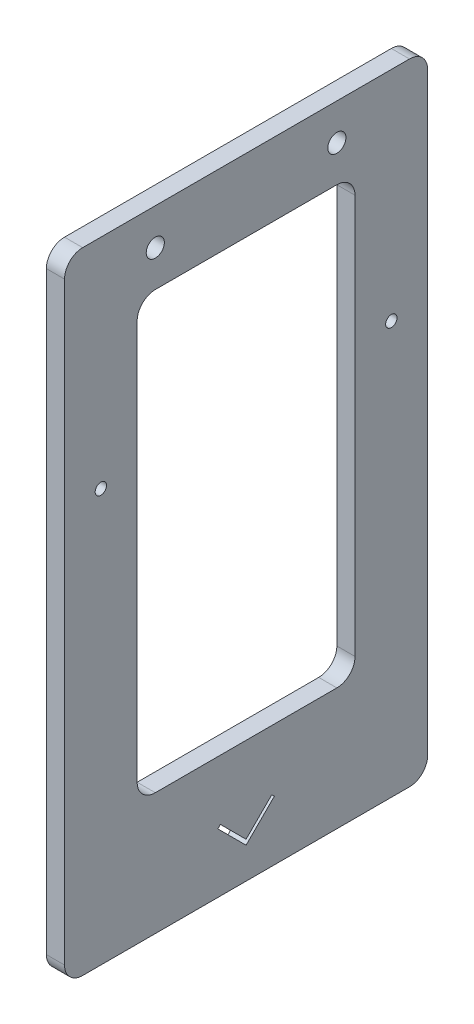
ISO-10303-21;
HEADER;
FILE_DESCRIPTION(('STEP AP214'),'2;1');
FILE_NAME('part.step','',(''),(''),'','','');
FILE_SCHEMA(('AUTOMOTIVE_DESIGN { 1 0 10303 214 1 1 1 1 }'));
ENDSEC;
DATA;
#1=APPLICATION_CONTEXT('core data for automotive mechanical design processes');
#2=APPLICATION_PROTOCOL_DEFINITION('international standard','automotive_design',2000,#1);
#3=PRODUCT_CONTEXT('',#1,'mechanical');
#4=PRODUCT('Part','Part','',(#3));
#5=PRODUCT_RELATED_PRODUCT_CATEGORY('part','',(#4));
#6=PRODUCT_DEFINITION_FORMATION('','',#4);
#7=PRODUCT_DEFINITION_CONTEXT('part definition',#1,'design');
#8=PRODUCT_DEFINITION('design','',#6,#7);
#9=PRODUCT_DEFINITION_SHAPE('','',#8);
#10=(LENGTH_UNIT() NAMED_UNIT(*) SI_UNIT(.MILLI.,.METRE.));
#11=(NAMED_UNIT(*) PLANE_ANGLE_UNIT() SI_UNIT($,.RADIAN.));
#12=(NAMED_UNIT(*) SI_UNIT($,.STERADIAN.) SOLID_ANGLE_UNIT());
#13=UNCERTAINTY_MEASURE_WITH_UNIT(LENGTH_MEASURE(1.E-05),#10,'distance_accuracy_value','');
#14=(GEOMETRIC_REPRESENTATION_CONTEXT(3) GLOBAL_UNCERTAINTY_ASSIGNED_CONTEXT((#13)) GLOBAL_UNIT_ASSIGNED_CONTEXT((#10,
#11,#12)) REPRESENTATION_CONTEXT('',''));
#15=CARTESIAN_POINT('',(0.,0.,0.));
#16=DIRECTION('',(0.,0.,1.));
#17=DIRECTION('',(1.,0.,0.));
#18=AXIS2_PLACEMENT_3D('',#15,#16,#17);
#19=CARTESIAN_POINT('',(6.35,-103.886,57.15));
#20=DIRECTION('',(-1.,0.,0.));
#21=DIRECTION('',(0.,0.,1.));
#22=AXIS2_PLACEMENT_3D('',#19,#20,#21);
#23=PLANE('',#22);
#24=CARTESIAN_POINT('',(6.35,34.036,50.8));
#25=DIRECTION('',(1.,0.,0.));
#26=DIRECTION('',(0.,0.,-1.));
#27=AXIS2_PLACEMENT_3D('',#24,#25,#26);
#28=CIRCLE('',#27,1.984375);
#29=CARTESIAN_POINT('',(6.35,34.036,48.815625));
#30=VERTEX_POINT('',#29);
#31=EDGE_CURVE('E593',#30,#30,#28,.T.);
#32=ORIENTED_EDGE('',*,*,#31,.F.);
#33=EDGE_LOOP('',(#32));
#34=FACE_BOUND('',#33,.T.);
#35=CARTESIAN_POINT('',(6.35,34.036,-50.8));
#36=DIRECTION('',(1.,0.,0.));
#37=DIRECTION('',(0.,0.,1.));
#38=AXIS2_PLACEMENT_3D('',#35,#36,#37);
#39=CIRCLE('',#38,1.984375);
#40=CARTESIAN_POINT('',(6.35,34.036,-48.815625));
#41=VERTEX_POINT('',#40);
#42=EDGE_CURVE('E599',#41,#41,#39,.T.);
#43=ORIENTED_EDGE('',*,*,#42,.F.);
#44=EDGE_LOOP('',(#43));
#45=FACE_BOUND('',#44,.T.);
#46=CARTESIAN_POINT('',(6.35,97.536,31.75));
#47=DIRECTION('',(-1.,0.,0.));
#48=DIRECTION('',(0.,0.,1.));
#49=AXIS2_PLACEMENT_3D('',#46,#47,#48);
#50=CIRCLE('',#49,3.175);
#51=CARTESIAN_POINT('',(6.35,97.536,34.925));
#52=VERTEX_POINT('',#51);
#53=EDGE_CURVE('E612',#52,#52,#50,.T.);
#54=ORIENTED_EDGE('',*,*,#53,.T.);
#55=EDGE_LOOP('',(#54));
#56=FACE_BOUND('',#55,.T.);
#57=CARTESIAN_POINT('',(6.35,97.536,-31.75));
#58=DIRECTION('',(-1.,0.,0.));
#59=DIRECTION('',(0.,0.,1.));
#60=AXIS2_PLACEMENT_3D('',#57,#58,#59);
#61=CIRCLE('',#60,3.175);
#62=CARTESIAN_POINT('',(6.35,97.536,-28.575));
#63=VERTEX_POINT('',#62);
#64=EDGE_CURVE('E607',#63,#63,#61,.T.);
#65=ORIENTED_EDGE('',*,*,#64,.T.);
#66=EDGE_LOOP('',(#65));
#67=FACE_BOUND('',#66,.T.);
#68=DIRECTION('',(0.,0.707106781186546,0.707106781186549));
#69=VECTOR('',#68,1.);
#70=CARTESIAN_POINT('',(6.35,-97.536,0.));
#71=LINE('',#70,#69);
#72=CARTESIAN_POINT('',(6.35,-97.536,0.));
#73=VERTEX_POINT('',#72);
#74=CARTESIAN_POINT('',(6.35,-88.5557438789309,8.98025612106916));
#75=VERTEX_POINT('',#74);
#76=EDGE_CURVE('E205',#73,#75,#71,.T.);
#77=ORIENTED_EDGE('',*,*,#76,.F.);
#78=DIRECTION('',(0.,-0.707106781186548,0.707106781186547));
#79=VECTOR('',#78,1.);
#80=CARTESIAN_POINT('',(6.35,-97.536,0.));
#81=LINE('',#80,#79);
#82=CARTESIAN_POINT('',(6.35,-88.5557438789308,-8.98025612106914));
#83=VERTEX_POINT('',#82);
#84=EDGE_CURVE('E51',#83,#73,#81,.T.);
#85=ORIENTED_EDGE('',*,*,#84,.F.);
#86=DIRECTION('',(0.,0.707106781186549,0.707106781186546));
#87=VECTOR('',#86,1.);
#88=CARTESIAN_POINT('',(6.35,-88.5557438789308,-8.98025612106914));
#89=LINE('',#88,#87);
#90=CARTESIAN_POINT('',(6.35,-89.4537694910378,-9.87828173317606));
#91=VERTEX_POINT('',#90);
#92=EDGE_CURVE('E197',#91,#83,#89,.T.);
#93=ORIENTED_EDGE('',*,*,#92,.F.);
#94=DIRECTION('',(0.,0.707106781186548,-0.707106781186547));
#95=VECTOR('',#94,1.);
#96=CARTESIAN_POINT('',(6.35,-89.4537694910378,-9.87828173317606));
#97=LINE('',#96,#95);
#98=CARTESIAN_POINT('',(6.35,-99.3320512242138,0.));
#99=VERTEX_POINT('',#98);
#100=EDGE_CURVE('E218',#99,#91,#97,.T.);
#101=ORIENTED_EDGE('',*,*,#100,.F.);
#102=DIRECTION('',(0.,-0.707106781186547,-0.707106781186548));
#103=VECTOR('',#102,1.);
#104=CARTESIAN_POINT('',(6.35,-89.4537694910378,9.87828173317608));
#105=LINE('',#104,#103);
#106=CARTESIAN_POINT('',(6.35,-89.4537694910378,9.87828173317608));
#107=VERTEX_POINT('',#106);
#108=EDGE_CURVE('E215',#107,#99,#105,.T.);
#109=ORIENTED_EDGE('',*,*,#108,.F.);
#110=DIRECTION('',(0.,-0.707106781186549,0.707106781186546));
#111=VECTOR('',#110,1.);
#112=CARTESIAN_POINT('',(6.35,-88.5557438789309,8.98025612106916));
#113=LINE('',#112,#111);
#114=EDGE_CURVE('E212',#75,#107,#113,.T.);
#115=ORIENTED_EDGE('',*,*,#114,.F.);
#116=EDGE_LOOP('',(#77,#85,#93,#101,#109,#115));
#117=FACE_BOUND('',#116,.T.);
#118=CARTESIAN_POINT('',(6.35,-103.886,57.15));
#119=DIRECTION('',(1.,0.,0.));
#120=DIRECTION('',(0.,0.,1.));
#121=AXIS2_PLACEMENT_3D('',#118,#119,#120);
#122=CIRCLE('',#121,6.35);
#123=CARTESIAN_POINT('',(6.35,-103.886,63.5));
#124=VERTEX_POINT('',#123);
#125=CARTESIAN_POINT('',(6.35,-110.236,57.15));
#126=VERTEX_POINT('',#125);
#127=EDGE_CURVE('E290',#124,#126,#122,.T.);
#128=ORIENTED_EDGE('',*,*,#127,.T.);
#129=DIRECTION('',(0.,0.,-1.));
#130=VECTOR('',#129,1.);
#131=CARTESIAN_POINT('',(6.35,-110.236,57.15));
#132=LINE('',#131,#130);
#133=CARTESIAN_POINT('',(6.35,-110.236,-57.15));
#134=VERTEX_POINT('',#133);
#135=EDGE_CURVE('E293',#126,#134,#132,.T.);
#136=ORIENTED_EDGE('',*,*,#135,.T.);
#137=CARTESIAN_POINT('',(6.35,-103.886,-57.15));
#138=DIRECTION('',(1.,0.,0.));
#139=DIRECTION('',(0.,0.,1.));
#140=AXIS2_PLACEMENT_3D('',#137,#138,#139);
#141=CIRCLE('',#140,6.35);
#142=CARTESIAN_POINT('',(6.35,-103.886,-63.5));
#143=VERTEX_POINT('',#142);
#144=EDGE_CURVE('E296',#134,#143,#141,.T.);
#145=ORIENTED_EDGE('',*,*,#144,.T.);
#146=DIRECTION('',(0.,1.,0.));
#147=VECTOR('',#146,1.);
#148=CARTESIAN_POINT('',(6.35,-103.886,-63.5));
#149=LINE('',#148,#147);
#150=CARTESIAN_POINT('',(6.35,103.886,-63.5));
#151=VERTEX_POINT('',#150);
#152=EDGE_CURVE('E298',#143,#151,#149,.T.);
#153=ORIENTED_EDGE('',*,*,#152,.T.);
#154=CARTESIAN_POINT('',(6.35,103.886,-57.15));
#155=DIRECTION('',(1.,0.,0.));
#156=DIRECTION('',(0.,0.,-1.));
#157=AXIS2_PLACEMENT_3D('',#154,#155,#156);
#158=CIRCLE('',#157,6.35);
#159=CARTESIAN_POINT('',(6.35,110.236,-57.15));
#160=VERTEX_POINT('',#159);
#161=EDGE_CURVE('E300',#151,#160,#158,.T.);
#162=ORIENTED_EDGE('',*,*,#161,.T.);
#163=DIRECTION('',(0.,0.,1.));
#164=VECTOR('',#163,1.);
#165=CARTESIAN_POINT('',(6.35,110.236,57.15));
#166=LINE('',#165,#164);
#167=CARTESIAN_POINT('',(6.35,110.236,57.15));
#168=VERTEX_POINT('',#167);
#169=EDGE_CURVE('E302',#160,#168,#166,.T.);
#170=ORIENTED_EDGE('',*,*,#169,.T.);
#171=CARTESIAN_POINT('',(6.35,103.886,57.15));
#172=DIRECTION('',(1.,0.,0.));
#173=DIRECTION('',(0.,0.,1.));
#174=AXIS2_PLACEMENT_3D('',#171,#172,#173);
#175=CIRCLE('',#174,6.35);
#176=CARTESIAN_POINT('',(6.35,103.886,63.5));
#177=VERTEX_POINT('',#176);
#178=EDGE_CURVE('E304',#168,#177,#175,.T.);
#179=ORIENTED_EDGE('',*,*,#178,.T.);
#180=DIRECTION('',(0.,-1.,0.));
#181=VECTOR('',#180,1.);
#182=CARTESIAN_POINT('',(6.35,-103.886,63.5));
#183=LINE('',#182,#181);
#184=EDGE_CURVE('E306',#177,#124,#183,.T.);
#185=ORIENTED_EDGE('',*,*,#184,.T.);
#186=EDGE_LOOP('',(#128,#136,#145,#153,#162,#170,#179,#185));
#187=FACE_BOUND('',#186,.T.);
#188=CARTESIAN_POINT('',(6.35,-61.214,-31.75));
#189=DIRECTION('',(1.,0.,0.));
#190=DIRECTION('',(0.,0.,-1.));
#191=AXIS2_PLACEMENT_3D('',#188,#189,#190);
#192=CIRCLE('',#191,6.35000000000001);
#193=CARTESIAN_POINT('',(6.35,-67.564,-31.75));
#194=VERTEX_POINT('',#193);
#195=CARTESIAN_POINT('',(6.35,-61.214,-38.1));
#196=VERTEX_POINT('',#195);
#197=EDGE_CURVE('E231',#194,#196,#192,.T.);
#198=ORIENTED_EDGE('',*,*,#197,.F.);
#199=DIRECTION('',(0.,0.,-1.));
#200=VECTOR('',#199,1.);
#201=CARTESIAN_POINT('',(6.35,-67.564,31.75));
#202=LINE('',#201,#200);
#203=CARTESIAN_POINT('',(6.35,-67.564,31.75));
#204=VERTEX_POINT('',#203);
#205=EDGE_CURVE('E247',#204,#194,#202,.T.);
#206=ORIENTED_EDGE('',*,*,#205,.F.);
#207=CARTESIAN_POINT('',(6.35,-61.214,31.75));
#208=DIRECTION('',(1.,0.,0.));
#209=DIRECTION('',(0.,0.,1.));
#210=AXIS2_PLACEMENT_3D('',#207,#208,#209);
#211=CIRCLE('',#210,6.35);
#212=CARTESIAN_POINT('',(6.35,-61.214,38.1));
#213=VERTEX_POINT('',#212);
#214=EDGE_CURVE('E244',#213,#204,#211,.T.);
#215=ORIENTED_EDGE('',*,*,#214,.F.);
#216=DIRECTION('',(0.,-1.,0.));
#217=VECTOR('',#216,1.);
#218=CARTESIAN_POINT('',(6.35,-61.214,38.1));
#219=LINE('',#218,#217);
#220=CARTESIAN_POINT('',(6.35,78.486,38.1));
#221=VERTEX_POINT('',#220);
#222=EDGE_CURVE('E242',#221,#213,#219,.T.);
#223=ORIENTED_EDGE('',*,*,#222,.F.);
#224=CARTESIAN_POINT('',(6.35,78.486,31.75));
#225=DIRECTION('',(1.,0.,0.));
#226=DIRECTION('',(0.,0.,1.));
#227=AXIS2_PLACEMENT_3D('',#224,#225,#226);
#228=CIRCLE('',#227,6.35);
#229=CARTESIAN_POINT('',(6.35,84.836,31.75));
#230=VERTEX_POINT('',#229);
#231=EDGE_CURVE('E240',#230,#221,#228,.T.);
#232=ORIENTED_EDGE('',*,*,#231,.F.);
#233=DIRECTION('',(0.,0.,1.));
#234=VECTOR('',#233,1.);
#235=CARTESIAN_POINT('',(6.35,84.836,31.75));
#236=LINE('',#235,#234);
#237=CARTESIAN_POINT('',(6.35,84.836,-31.75));
#238=VERTEX_POINT('',#237);
#239=EDGE_CURVE('E238',#238,#230,#236,.T.);
#240=ORIENTED_EDGE('',*,*,#239,.F.);
#241=CARTESIAN_POINT('',(6.35,78.486,-31.75));
#242=DIRECTION('',(1.,0.,0.));
#243=DIRECTION('',(0.,0.,1.));
#244=AXIS2_PLACEMENT_3D('',#241,#242,#243);
#245=CIRCLE('',#244,6.35);
#246=CARTESIAN_POINT('',(6.35,78.486,-38.1));
#247=VERTEX_POINT('',#246);
#248=EDGE_CURVE('E236',#247,#238,#245,.T.);
#249=ORIENTED_EDGE('',*,*,#248,.F.);
#250=DIRECTION('',(0.,1.,0.));
#251=VECTOR('',#250,1.);
#252=CARTESIAN_POINT('',(6.35,-61.214,-38.1));
#253=LINE('',#252,#251);
#254=EDGE_CURVE('E233',#196,#247,#253,.T.);
#255=ORIENTED_EDGE('',*,*,#254,.F.);
#256=EDGE_LOOP('',(#198,#206,#215,#223,#232,#240,#249,#255));
#257=FACE_BOUND('',#256,.T.);
#258=ADVANCED_FACE('F36',(#34,#45,#56,#67,#117,#187,#257),#23,.F.);
#259=CARTESIAN_POINT('',(0.,-103.886,57.15));
#260=DIRECTION('',(-1.,0.,0.));
#261=DIRECTION('',(0.,0.,1.));
#262=AXIS2_PLACEMENT_3D('',#259,#260,#261);
#263=PLANE('',#262);
#264=CARTESIAN_POINT('',(0.,34.036,50.8));
#265=DIRECTION('',(1.,0.,0.));
#266=DIRECTION('',(0.,0.,-1.));
#267=AXIS2_PLACEMENT_3D('',#264,#265,#266);
#268=CIRCLE('',#267,1.984375);
#269=CARTESIAN_POINT('',(0.,34.036,48.815625));
#270=VERTEX_POINT('',#269);
#271=EDGE_CURVE('E591',#270,#270,#268,.T.);
#272=ORIENTED_EDGE('',*,*,#271,.T.);
#273=EDGE_LOOP('',(#272));
#274=FACE_BOUND('',#273,.T.);
#275=CARTESIAN_POINT('',(0.,34.036,-50.8));
#276=DIRECTION('',(1.,0.,0.));
#277=DIRECTION('',(0.,0.,1.));
#278=AXIS2_PLACEMENT_3D('',#275,#276,#277);
#279=CIRCLE('',#278,1.984375);
#280=CARTESIAN_POINT('',(0.,34.036,-48.815625));
#281=VERTEX_POINT('',#280);
#282=EDGE_CURVE('E594',#281,#281,#279,.T.);
#283=ORIENTED_EDGE('',*,*,#282,.T.);
#284=EDGE_LOOP('',(#283));
#285=FACE_BOUND('',#284,.T.);
#286=CARTESIAN_POINT('',(0.,97.536,31.75));
#287=DIRECTION('',(1.,0.,0.));
#288=DIRECTION('',(0.,0.,-1.));
#289=AXIS2_PLACEMENT_3D('',#286,#287,#288);
#290=CIRCLE('',#289,3.175);
#291=CARTESIAN_POINT('',(0.,97.536,28.575));
#292=VERTEX_POINT('',#291);
#293=EDGE_CURVE('E604',#292,#292,#290,.T.);
#294=ORIENTED_EDGE('',*,*,#293,.T.);
#295=EDGE_LOOP('',(#294));
#296=FACE_BOUND('',#295,.T.);
#297=CARTESIAN_POINT('',(0.,97.536,-31.75));
#298=DIRECTION('',(1.,0.,0.));
#299=DIRECTION('',(0.,0.,-1.));
#300=AXIS2_PLACEMENT_3D('',#297,#298,#299);
#301=CIRCLE('',#300,3.175);
#302=CARTESIAN_POINT('',(0.,97.536,-34.925));
#303=VERTEX_POINT('',#302);
#304=EDGE_CURVE('E596',#303,#303,#301,.T.);
#305=ORIENTED_EDGE('',*,*,#304,.T.);
#306=EDGE_LOOP('',(#305));
#307=FACE_BOUND('',#306,.T.);
#308=DIRECTION('',(0.,-0.707106781186548,0.707106781186547));
#309=VECTOR('',#308,1.);
#310=CARTESIAN_POINT('',(0.,-97.536,0.));
#311=LINE('',#310,#309);
#312=CARTESIAN_POINT('',(0.,-88.5557438789308,-8.98025612106914));
#313=VERTEX_POINT('',#312);
#314=CARTESIAN_POINT('',(0.,-97.536,0.));
#315=VERTEX_POINT('',#314);
#316=EDGE_CURVE('E195',#313,#315,#311,.T.);
#317=ORIENTED_EDGE('',*,*,#316,.T.);
#318=DIRECTION('',(0.,0.707106781186546,0.707106781186549));
#319=VECTOR('',#318,1.);
#320=CARTESIAN_POINT('',(0.,-97.536,0.));
#321=LINE('',#320,#319);
#322=CARTESIAN_POINT('',(0.,-88.5557438789309,8.98025612106916));
#323=VERTEX_POINT('',#322);
#324=EDGE_CURVE('E184',#315,#323,#321,.T.);
#325=ORIENTED_EDGE('',*,*,#324,.T.);
#326=DIRECTION('',(0.,-0.707106781186549,0.707106781186546));
#327=VECTOR('',#326,1.);
#328=CARTESIAN_POINT('',(0.,-88.5557438789309,8.98025612106916));
#329=LINE('',#328,#327);
#330=CARTESIAN_POINT('',(0.,-89.4537694910378,9.87828173317608));
#331=VERTEX_POINT('',#330);
#332=EDGE_CURVE('E615',#323,#331,#329,.T.);
#333=ORIENTED_EDGE('',*,*,#332,.T.);
#334=DIRECTION('',(0.,-0.707106781186547,-0.707106781186548));
#335=VECTOR('',#334,1.);
#336=CARTESIAN_POINT('',(0.,-89.4537694910378,9.87828173317608));
#337=LINE('',#336,#335);
#338=CARTESIAN_POINT('',(0.,-99.3320512242138,0.));
#339=VERTEX_POINT('',#338);
#340=EDGE_CURVE('E617',#331,#339,#337,.T.);
#341=ORIENTED_EDGE('',*,*,#340,.T.);
#342=DIRECTION('',(0.,0.707106781186548,-0.707106781186547));
#343=VECTOR('',#342,1.);
#344=CARTESIAN_POINT('',(0.,-89.4537694910378,-9.87828173317606));
#345=LINE('',#344,#343);
#346=CARTESIAN_POINT('',(0.,-89.4537694910378,-9.87828173317606));
#347=VERTEX_POINT('',#346);
#348=EDGE_CURVE('E207',#339,#347,#345,.T.);
#349=ORIENTED_EDGE('',*,*,#348,.T.);
#350=DIRECTION('',(0.,0.707106781186549,0.707106781186546));
#351=VECTOR('',#350,1.);
#352=CARTESIAN_POINT('',(0.,-88.5557438789308,-8.98025612106914));
#353=LINE('',#352,#351);
#354=EDGE_CURVE('E203',#347,#313,#353,.T.);
#355=ORIENTED_EDGE('',*,*,#354,.T.);
#356=EDGE_LOOP('',(#317,#325,#333,#341,#349,#355));
#357=FACE_BOUND('',#356,.T.);
#358=CARTESIAN_POINT('',(0.,-103.886,57.15));
#359=DIRECTION('',(1.,0.,0.));
#360=DIRECTION('',(0.,0.,1.));
#361=AXIS2_PLACEMENT_3D('',#358,#359,#360);
#362=CIRCLE('',#361,6.35);
#363=CARTESIAN_POINT('',(0.,-103.886,63.5));
#364=VERTEX_POINT('',#363);
#365=CARTESIAN_POINT('',(0.,-110.236,57.15));
#366=VERTEX_POINT('',#365);
#367=EDGE_CURVE('E289',#364,#366,#362,.T.);
#368=ORIENTED_EDGE('',*,*,#367,.F.);
#369=DIRECTION('',(0.,-1.,0.));
#370=VECTOR('',#369,1.);
#371=CARTESIAN_POINT('',(0.,-103.886,63.5));
#372=LINE('',#371,#370);
#373=CARTESIAN_POINT('',(0.,103.886,63.5));
#374=VERTEX_POINT('',#373);
#375=EDGE_CURVE('E294',#374,#364,#372,.T.);
#376=ORIENTED_EDGE('',*,*,#375,.F.);
#377=CARTESIAN_POINT('',(0.,103.886,57.15));
#378=DIRECTION('',(1.,0.,0.));
#379=DIRECTION('',(0.,0.,1.));
#380=AXIS2_PLACEMENT_3D('',#377,#378,#379);
#381=CIRCLE('',#380,6.35);
#382=CARTESIAN_POINT('',(0.,110.236,57.15));
#383=VERTEX_POINT('',#382);
#384=EDGE_CURVE('E321',#383,#374,#381,.T.);
#385=ORIENTED_EDGE('',*,*,#384,.F.);
#386=DIRECTION('',(0.,0.,1.));
#387=VECTOR('',#386,1.);
#388=CARTESIAN_POINT('',(0.,110.236,57.15));
#389=LINE('',#388,#387);
#390=CARTESIAN_POINT('',(0.,110.236,-57.15));
#391=VERTEX_POINT('',#390);
#392=EDGE_CURVE('E319',#391,#383,#389,.T.);
#393=ORIENTED_EDGE('',*,*,#392,.F.);
#394=CARTESIAN_POINT('',(0.,103.886,-57.15));
#395=DIRECTION('',(1.,0.,0.));
#396=DIRECTION('',(0.,0.,-1.));
#397=AXIS2_PLACEMENT_3D('',#394,#395,#396);
#398=CIRCLE('',#397,6.35);
#399=CARTESIAN_POINT('',(0.,103.886,-63.5));
#400=VERTEX_POINT('',#399);
#401=EDGE_CURVE('E317',#400,#391,#398,.T.);
#402=ORIENTED_EDGE('',*,*,#401,.F.);
#403=DIRECTION('',(0.,1.,0.));
#404=VECTOR('',#403,1.);
#405=CARTESIAN_POINT('',(0.,-103.886,-63.5));
#406=LINE('',#405,#404);
#407=CARTESIAN_POINT('',(0.,-103.886,-63.5));
#408=VERTEX_POINT('',#407);
#409=EDGE_CURVE('E315',#408,#400,#406,.T.);
#410=ORIENTED_EDGE('',*,*,#409,.F.);
#411=CARTESIAN_POINT('',(0.,-103.886,-57.15));
#412=DIRECTION('',(1.,0.,0.));
#413=DIRECTION('',(0.,0.,1.));
#414=AXIS2_PLACEMENT_3D('',#411,#412,#413);
#415=CIRCLE('',#414,6.35);
#416=CARTESIAN_POINT('',(0.,-110.236,-57.15));
#417=VERTEX_POINT('',#416);
#418=EDGE_CURVE('E313',#417,#408,#415,.T.);
#419=ORIENTED_EDGE('',*,*,#418,.F.);
#420=DIRECTION('',(0.,0.,-1.));
#421=VECTOR('',#420,1.);
#422=CARTESIAN_POINT('',(0.,-110.236,57.15));
#423=LINE('',#422,#421);
#424=EDGE_CURVE('E311',#366,#417,#423,.T.);
#425=ORIENTED_EDGE('',*,*,#424,.F.);
#426=EDGE_LOOP('',(#368,#376,#385,#393,#402,#410,#419,#425));
#427=FACE_BOUND('',#426,.T.);
#428=DIRECTION('',(0.,0.,-1.));
#429=VECTOR('',#428,1.);
#430=CARTESIAN_POINT('',(0.,-67.564,31.75));
#431=LINE('',#430,#429);
#432=CARTESIAN_POINT('',(0.,-67.564,31.75));
#433=VERTEX_POINT('',#432);
#434=CARTESIAN_POINT('',(0.,-67.564,-31.75));
#435=VERTEX_POINT('',#434);
#436=EDGE_CURVE('E234',#433,#435,#431,.T.);
#437=ORIENTED_EDGE('',*,*,#436,.T.);
#438=CARTESIAN_POINT('',(0.,-61.214,-31.75));
#439=DIRECTION('',(1.,0.,0.));
#440=DIRECTION('',(0.,0.,-1.));
#441=AXIS2_PLACEMENT_3D('',#438,#439,#440);
#442=CIRCLE('',#441,6.35000000000001);
#443=CARTESIAN_POINT('',(0.,-61.214,-38.1));
#444=VERTEX_POINT('',#443);
#445=EDGE_CURVE('E191',#435,#444,#442,.T.);
#446=ORIENTED_EDGE('',*,*,#445,.T.);
#447=DIRECTION('',(0.,1.,0.));
#448=VECTOR('',#447,1.);
#449=CARTESIAN_POINT('',(0.,-61.214,-38.1));
#450=LINE('',#449,#448);
#451=CARTESIAN_POINT('',(0.,78.486,-38.1));
#452=VERTEX_POINT('',#451);
#453=EDGE_CURVE('E252',#444,#452,#450,.T.);
#454=ORIENTED_EDGE('',*,*,#453,.T.);
#455=CARTESIAN_POINT('',(0.,78.486,-31.75));
#456=DIRECTION('',(1.,0.,0.));
#457=DIRECTION('',(0.,0.,1.));
#458=AXIS2_PLACEMENT_3D('',#455,#456,#457);
#459=CIRCLE('',#458,6.35);
#460=CARTESIAN_POINT('',(0.,84.836,-31.75));
#461=VERTEX_POINT('',#460);
#462=EDGE_CURVE('E255',#452,#461,#459,.T.);
#463=ORIENTED_EDGE('',*,*,#462,.T.);
#464=DIRECTION('',(0.,0.,1.));
#465=VECTOR('',#464,1.);
#466=CARTESIAN_POINT('',(0.,84.836,31.75));
#467=LINE('',#466,#465);
#468=CARTESIAN_POINT('',(0.,84.836,31.75));
#469=VERTEX_POINT('',#468);
#470=EDGE_CURVE('E258',#461,#469,#467,.T.);
#471=ORIENTED_EDGE('',*,*,#470,.T.);
#472=CARTESIAN_POINT('',(0.,78.486,31.75));
#473=DIRECTION('',(1.,0.,0.));
#474=DIRECTION('',(0.,0.,1.));
#475=AXIS2_PLACEMENT_3D('',#472,#473,#474);
#476=CIRCLE('',#475,6.35);
#477=CARTESIAN_POINT('',(0.,78.486,38.1));
#478=VERTEX_POINT('',#477);
#479=EDGE_CURVE('E261',#469,#478,#476,.T.);
#480=ORIENTED_EDGE('',*,*,#479,.T.);
#481=DIRECTION('',(0.,-1.,0.));
#482=VECTOR('',#481,1.);
#483=CARTESIAN_POINT('',(0.,-61.214,38.1));
#484=LINE('',#483,#482);
#485=CARTESIAN_POINT('',(0.,-61.214,38.1));
#486=VERTEX_POINT('',#485);
#487=EDGE_CURVE('E264',#478,#486,#484,.T.);
#488=ORIENTED_EDGE('',*,*,#487,.T.);
#489=CARTESIAN_POINT('',(0.,-61.214,31.75));
#490=DIRECTION('',(1.,0.,0.));
#491=DIRECTION('',(0.,0.,1.));
#492=AXIS2_PLACEMENT_3D('',#489,#490,#491);
#493=CIRCLE('',#492,6.35);
#494=EDGE_CURVE('E267',#486,#433,#493,.T.);
#495=ORIENTED_EDGE('',*,*,#494,.T.);
#496=EDGE_LOOP('',(#437,#446,#454,#463,#471,#480,#488,#495));
#497=FACE_BOUND('',#496,.T.);
#498=ADVANCED_FACE('F200',(#274,#285,#296,#307,#357,#427,#497),#263,.T.);
#499=CARTESIAN_POINT('',(6.35,-103.886,57.15));
#500=DIRECTION('',(-1.,0.,0.));
#501=DIRECTION('',(0.,0.,1.));
#502=AXIS2_PLACEMENT_3D('',#499,#500,#501);
#503=CYLINDRICAL_SURFACE('',#502,6.35);
#504=ORIENTED_EDGE('',*,*,#367,.T.);
#505=DIRECTION('',(-1.,0.,0.));
#506=VECTOR('',#505,1.);
#507=CARTESIAN_POINT('',(6.35,-110.236,57.15));
#508=LINE('',#507,#506);
#509=EDGE_CURVE('E11',#126,#366,#508,.T.);
#510=ORIENTED_EDGE('',*,*,#509,.F.);
#511=ORIENTED_EDGE('',*,*,#127,.F.);
#512=DIRECTION('',(-1.,0.,0.));
#513=VECTOR('',#512,1.);
#514=CARTESIAN_POINT('',(6.35,-103.886,63.5));
#515=LINE('',#514,#513);
#516=EDGE_CURVE('E308',#124,#364,#515,.T.);
#517=ORIENTED_EDGE('',*,*,#516,.T.);
#518=EDGE_LOOP('',(#504,#510,#511,#517));
#519=FACE_BOUND('',#518,.T.);
#520=ADVANCED_FACE('F38',(#519),#503,.T.);
#521=CARTESIAN_POINT('',(6.35,-110.236,57.15));
#522=DIRECTION('',(0.,1.,0.));
#523=DIRECTION('',(0.,0.,1.));
#524=AXIS2_PLACEMENT_3D('',#521,#522,#523);
#525=PLANE('',#524);
#526=ORIENTED_EDGE('',*,*,#424,.T.);
#527=DIRECTION('',(-1.,0.,0.));
#528=VECTOR('',#527,1.);
#529=CARTESIAN_POINT('',(6.35,-110.236,-57.15));
#530=LINE('',#529,#528);
#531=EDGE_CURVE('E44',#134,#417,#530,.T.);
#532=ORIENTED_EDGE('',*,*,#531,.F.);
#533=ORIENTED_EDGE('',*,*,#135,.F.);
#534=ORIENTED_EDGE('',*,*,#509,.T.);
#535=EDGE_LOOP('',(#526,#532,#533,#534));
#536=FACE_BOUND('',#535,.T.);
#537=ADVANCED_FACE('F367',(#536),#525,.F.);
#538=CARTESIAN_POINT('',(6.35,-103.886,-57.15));
#539=DIRECTION('',(-1.,0.,0.));
#540=DIRECTION('',(0.,0.,1.));
#541=AXIS2_PLACEMENT_3D('',#538,#539,#540);
#542=CYLINDRICAL_SURFACE('',#541,6.35);
#543=ORIENTED_EDGE('',*,*,#418,.T.);
#544=DIRECTION('',(-1.,0.,0.));
#545=VECTOR('',#544,1.);
#546=CARTESIAN_POINT('',(6.35,-103.886,-63.5));
#547=LINE('',#546,#545);
#548=EDGE_CURVE('E338',#143,#408,#547,.T.);
#549=ORIENTED_EDGE('',*,*,#548,.F.);
#550=ORIENTED_EDGE('',*,*,#144,.F.);
#551=ORIENTED_EDGE('',*,*,#531,.T.);
#552=EDGE_LOOP('',(#543,#549,#550,#551));
#553=FACE_BOUND('',#552,.T.);
#554=ADVANCED_FACE('F345',(#553),#542,.T.);
#555=CARTESIAN_POINT('',(6.35,-103.886,-63.5));
#556=DIRECTION('',(0.,0.,1.));
#557=DIRECTION('',(1.,0.,0.));
#558=AXIS2_PLACEMENT_3D('',#555,#556,#557);
#559=PLANE('',#558);
#560=ORIENTED_EDGE('',*,*,#409,.T.);
#561=DIRECTION('',(-1.,0.,0.));
#562=VECTOR('',#561,1.);
#563=CARTESIAN_POINT('',(6.35,103.886,-63.5));
#564=LINE('',#563,#562);
#565=EDGE_CURVE('E335',#151,#400,#564,.T.);
#566=ORIENTED_EDGE('',*,*,#565,.F.);
#567=ORIENTED_EDGE('',*,*,#152,.F.);
#568=ORIENTED_EDGE('',*,*,#548,.T.);
#569=EDGE_LOOP('',(#560,#566,#567,#568));
#570=FACE_BOUND('',#569,.T.);
#571=ADVANCED_FACE('F355',(#570),#559,.F.);
#572=CARTESIAN_POINT('',(6.35,103.886,-57.15));
#573=DIRECTION('',(-1.,0.,0.));
#574=DIRECTION('',(0.,0.,1.));
#575=AXIS2_PLACEMENT_3D('',#572,#573,#574);
#576=CYLINDRICAL_SURFACE('',#575,6.35);
#577=ORIENTED_EDGE('',*,*,#401,.T.);
#578=DIRECTION('',(-1.,0.,0.));
#579=VECTOR('',#578,1.);
#580=CARTESIAN_POINT('',(6.35,110.236,-57.15));
#581=LINE('',#580,#579);
#582=EDGE_CURVE('E332',#160,#391,#581,.T.);
#583=ORIENTED_EDGE('',*,*,#582,.F.);
#584=ORIENTED_EDGE('',*,*,#161,.F.);
#585=ORIENTED_EDGE('',*,*,#565,.T.);
#586=EDGE_LOOP('',(#577,#583,#584,#585));
#587=FACE_BOUND('',#586,.T.);
#588=ADVANCED_FACE('F359',(#587),#576,.T.);
#589=CARTESIAN_POINT('',(6.35,110.236,57.15));
#590=DIRECTION('',(0.,-1.,0.));
#591=DIRECTION('',(0.,0.,-1.));
#592=AXIS2_PLACEMENT_3D('',#589,#590,#591);
#593=PLANE('',#592);
#594=ORIENTED_EDGE('',*,*,#392,.T.);
#595=DIRECTION('',(-1.,0.,0.));
#596=VECTOR('',#595,1.);
#597=CARTESIAN_POINT('',(6.35,110.236,57.15));
#598=LINE('',#597,#596);
#599=EDGE_CURVE('E329',#168,#383,#598,.T.);
#600=ORIENTED_EDGE('',*,*,#599,.F.);
#601=ORIENTED_EDGE('',*,*,#169,.F.);
#602=ORIENTED_EDGE('',*,*,#582,.T.);
#603=EDGE_LOOP('',(#594,#600,#601,#602));
#604=FACE_BOUND('',#603,.T.);
#605=ADVANCED_FACE('F380',(#604),#593,.F.);
#606=CARTESIAN_POINT('',(6.35,103.886,57.15));
#607=DIRECTION('',(-1.,0.,0.));
#608=DIRECTION('',(0.,0.,1.));
#609=AXIS2_PLACEMENT_3D('',#606,#607,#608);
#610=CYLINDRICAL_SURFACE('',#609,6.35);
#611=ORIENTED_EDGE('',*,*,#384,.T.);
#612=DIRECTION('',(-1.,0.,0.));
#613=VECTOR('',#612,1.);
#614=CARTESIAN_POINT('',(6.35,103.886,63.5));
#615=LINE('',#614,#613);
#616=EDGE_CURVE('E326',#177,#374,#615,.T.);
#617=ORIENTED_EDGE('',*,*,#616,.F.);
#618=ORIENTED_EDGE('',*,*,#178,.F.);
#619=ORIENTED_EDGE('',*,*,#599,.T.);
#620=EDGE_LOOP('',(#611,#617,#618,#619));
#621=FACE_BOUND('',#620,.T.);
#622=ADVANCED_FACE('F378',(#621),#610,.T.);
#623=CARTESIAN_POINT('',(6.35,-103.886,63.5));
#624=DIRECTION('',(0.,0.,-1.));
#625=DIRECTION('',(-1.,0.,0.));
#626=AXIS2_PLACEMENT_3D('',#623,#624,#625);
#627=PLANE('',#626);
#628=ORIENTED_EDGE('',*,*,#375,.T.);
#629=ORIENTED_EDGE('',*,*,#516,.F.);
#630=ORIENTED_EDGE('',*,*,#184,.F.);
#631=ORIENTED_EDGE('',*,*,#616,.T.);
#632=EDGE_LOOP('',(#628,#629,#630,#631));
#633=FACE_BOUND('',#632,.T.);
#634=ADVANCED_FACE('F373',(#633),#627,.F.);
#635=CARTESIAN_POINT('',(6.35,-61.214,-31.75));
#636=DIRECTION('',(-1.,0.,0.));
#637=DIRECTION('',(0.,0.,1.));
#638=AXIS2_PLACEMENT_3D('',#635,#636,#637);
#639=CYLINDRICAL_SURFACE('',#638,6.35000000000001);
#640=ORIENTED_EDGE('',*,*,#445,.F.);
#641=DIRECTION('',(-1.,0.,0.));
#642=VECTOR('',#641,1.);
#643=CARTESIAN_POINT('',(6.35,-67.564,-31.75));
#644=LINE('',#643,#642);
#645=EDGE_CURVE('E249',#194,#435,#644,.T.);
#646=ORIENTED_EDGE('',*,*,#645,.F.);
#647=ORIENTED_EDGE('',*,*,#197,.T.);
#648=DIRECTION('',(-1.,0.,0.));
#649=VECTOR('',#648,1.);
#650=CARTESIAN_POINT('',(6.35,-61.214,-38.1));
#651=LINE('',#650,#649);
#652=EDGE_CURVE('E286',#196,#444,#651,.T.);
#653=ORIENTED_EDGE('',*,*,#652,.T.);
#654=EDGE_LOOP('',(#640,#646,#647,#653));
#655=FACE_BOUND('',#654,.T.);
#656=ADVANCED_FACE('F401',(#655),#639,.F.);
#657=CARTESIAN_POINT('',(6.35,-61.214,-38.1));
#658=DIRECTION('',(0.,0.,1.));
#659=DIRECTION('',(0.,-1.,0.));
#660=AXIS2_PLACEMENT_3D('',#657,#658,#659);
#661=PLANE('',#660);
#662=ORIENTED_EDGE('',*,*,#453,.F.);
#663=ORIENTED_EDGE('',*,*,#652,.F.);
#664=ORIENTED_EDGE('',*,*,#254,.T.);
#665=DIRECTION('',(-1.,0.,0.));
#666=VECTOR('',#665,1.);
#667=CARTESIAN_POINT('',(6.35,78.486,-38.1));
#668=LINE('',#667,#666);
#669=EDGE_CURVE('E284',#247,#452,#668,.T.);
#670=ORIENTED_EDGE('',*,*,#669,.T.);
#671=EDGE_LOOP('',(#662,#663,#664,#670));
#672=FACE_BOUND('',#671,.T.);
#673=ADVANCED_FACE('F408',(#672),#661,.T.);
#674=CARTESIAN_POINT('',(6.35,78.486,-31.75));
#675=DIRECTION('',(-1.,0.,0.));
#676=DIRECTION('',(0.,0.,1.));
#677=AXIS2_PLACEMENT_3D('',#674,#675,#676);
#678=CYLINDRICAL_SURFACE('',#677,6.35);
#679=ORIENTED_EDGE('',*,*,#462,.F.);
#680=ORIENTED_EDGE('',*,*,#669,.F.);
#681=ORIENTED_EDGE('',*,*,#248,.T.);
#682=DIRECTION('',(-1.,0.,0.));
#683=VECTOR('',#682,1.);
#684=CARTESIAN_POINT('',(6.35,84.836,-31.75));
#685=LINE('',#684,#683);
#686=EDGE_CURVE('E282',#238,#461,#685,.T.);
#687=ORIENTED_EDGE('',*,*,#686,.T.);
#688=EDGE_LOOP('',(#679,#680,#681,#687));
#689=FACE_BOUND('',#688,.T.);
#690=ADVANCED_FACE('F413',(#689),#678,.F.);
#691=CARTESIAN_POINT('',(6.35,84.836,31.75));
#692=DIRECTION('',(0.,-1.,0.));
#693=DIRECTION('',(0.,0.,-1.));
#694=AXIS2_PLACEMENT_3D('',#691,#692,#693);
#695=PLANE('',#694);
#696=ORIENTED_EDGE('',*,*,#470,.F.);
#697=ORIENTED_EDGE('',*,*,#686,.F.);
#698=ORIENTED_EDGE('',*,*,#239,.T.);
#699=DIRECTION('',(-1.,0.,0.));
#700=VECTOR('',#699,1.);
#701=CARTESIAN_POINT('',(6.35,84.836,31.75));
#702=LINE('',#701,#700);
#703=EDGE_CURVE('E280',#230,#469,#702,.T.);
#704=ORIENTED_EDGE('',*,*,#703,.T.);
#705=EDGE_LOOP('',(#696,#697,#698,#704));
#706=FACE_BOUND('',#705,.T.);
#707=ADVANCED_FACE('F438',(#706),#695,.T.);
#708=CARTESIAN_POINT('',(6.35,78.486,31.75));
#709=DIRECTION('',(-1.,0.,0.));
#710=DIRECTION('',(0.,0.,1.));
#711=AXIS2_PLACEMENT_3D('',#708,#709,#710);
#712=CYLINDRICAL_SURFACE('',#711,6.35);
#713=ORIENTED_EDGE('',*,*,#479,.F.);
#714=ORIENTED_EDGE('',*,*,#703,.F.);
#715=ORIENTED_EDGE('',*,*,#231,.T.);
#716=DIRECTION('',(-1.,0.,0.));
#717=VECTOR('',#716,1.);
#718=CARTESIAN_POINT('',(6.35,78.486,38.1));
#719=LINE('',#718,#717);
#720=EDGE_CURVE('E278',#221,#478,#719,.T.);
#721=ORIENTED_EDGE('',*,*,#720,.T.);
#722=EDGE_LOOP('',(#713,#714,#715,#721));
#723=FACE_BOUND('',#722,.T.);
#724=ADVANCED_FACE('F443',(#723),#712,.F.);
#725=CARTESIAN_POINT('',(6.35,-61.214,38.1));
#726=DIRECTION('',(0.,0.,-1.));
#727=DIRECTION('',(-1.,0.,0.));
#728=AXIS2_PLACEMENT_3D('',#725,#726,#727);
#729=PLANE('',#728);
#730=ORIENTED_EDGE('',*,*,#487,.F.);
#731=ORIENTED_EDGE('',*,*,#720,.F.);
#732=ORIENTED_EDGE('',*,*,#222,.T.);
#733=DIRECTION('',(-1.,0.,0.));
#734=VECTOR('',#733,1.);
#735=CARTESIAN_POINT('',(6.35,-61.214,38.1));
#736=LINE('',#735,#734);
#737=EDGE_CURVE('E276',#213,#486,#736,.T.);
#738=ORIENTED_EDGE('',*,*,#737,.T.);
#739=EDGE_LOOP('',(#730,#731,#732,#738));
#740=FACE_BOUND('',#739,.T.);
#741=ADVANCED_FACE('F446',(#740),#729,.T.);
#742=CARTESIAN_POINT('',(6.35,-61.214,31.75));
#743=DIRECTION('',(-1.,0.,0.));
#744=DIRECTION('',(0.,0.,1.));
#745=AXIS2_PLACEMENT_3D('',#742,#743,#744);
#746=CYLINDRICAL_SURFACE('',#745,6.35);
#747=ORIENTED_EDGE('',*,*,#494,.F.);
#748=ORIENTED_EDGE('',*,*,#737,.F.);
#749=ORIENTED_EDGE('',*,*,#214,.T.);
#750=DIRECTION('',(-1.,0.,0.));
#751=VECTOR('',#750,1.);
#752=CARTESIAN_POINT('',(6.35,-67.564,31.75));
#753=LINE('',#752,#751);
#754=EDGE_CURVE('E274',#204,#433,#753,.T.);
#755=ORIENTED_EDGE('',*,*,#754,.T.);
#756=EDGE_LOOP('',(#747,#748,#749,#755));
#757=FACE_BOUND('',#756,.T.);
#758=ADVANCED_FACE('F426',(#757),#746,.F.);
#759=CARTESIAN_POINT('',(6.35,-67.564,31.75));
#760=DIRECTION('',(0.,1.,0.));
#761=DIRECTION('',(0.,0.,1.));
#762=AXIS2_PLACEMENT_3D('',#759,#760,#761);
#763=PLANE('',#762);
#764=ORIENTED_EDGE('',*,*,#436,.F.);
#765=ORIENTED_EDGE('',*,*,#754,.F.);
#766=ORIENTED_EDGE('',*,*,#205,.T.);
#767=ORIENTED_EDGE('',*,*,#645,.T.);
#768=EDGE_LOOP('',(#764,#765,#766,#767));
#769=FACE_BOUND('',#768,.T.);
#770=ADVANCED_FACE('F420',(#769),#763,.T.);
#771=CARTESIAN_POINT('',(-0.00100000000000013,-97.536,0.));
#772=DIRECTION('',(0.,0.707106781186547,0.707106781186548));
#773=DIRECTION('',(0.,-0.707106781186548,0.707106781186547));
#774=AXIS2_PLACEMENT_3D('',#771,#772,#773);
#775=PLANE('',#774);
#776=DIRECTION('',(1.,0.,0.));
#777=VECTOR('',#776,1.);
#778=CARTESIAN_POINT('',(-0.00100000000000013,-88.5557438789308,-8.98025612106914));
#779=LINE('',#778,#777);
#780=EDGE_CURVE('E192',#313,#83,#779,.T.);
#781=ORIENTED_EDGE('',*,*,#780,.T.);
#782=ORIENTED_EDGE('',*,*,#84,.T.);
#783=DIRECTION('',(1.,0.,0.));
#784=VECTOR('',#783,1.);
#785=CARTESIAN_POINT('',(-0.00100000000000013,-97.536,0.));
#786=LINE('',#785,#784);
#787=EDGE_CURVE('E186',#315,#73,#786,.T.);
#788=ORIENTED_EDGE('',*,*,#787,.F.);
#789=ORIENTED_EDGE('',*,*,#316,.F.);
#790=EDGE_LOOP('',(#781,#782,#788,#789));
#791=FACE_BOUND('',#790,.T.);
#792=ADVANCED_FACE('F194',(#791),#775,.F.);
#793=CARTESIAN_POINT('',(-0.00100000000000013,-88.5557438789308,-8.98025612106914));
#794=DIRECTION('',(0.,0.707106781186546,-0.707106781186549));
#795=DIRECTION('',(0.,0.707106781186549,0.707106781186546));
#796=AXIS2_PLACEMENT_3D('',#793,#794,#795);
#797=PLANE('',#796);
#798=DIRECTION('',(1.,0.,0.));
#799=VECTOR('',#798,1.);
#800=CARTESIAN_POINT('',(-0.00100000000000013,-89.4537694910378,-9.87828173317606));
#801=LINE('',#800,#799);
#802=EDGE_CURVE('E224',#347,#91,#801,.T.);
#803=ORIENTED_EDGE('',*,*,#802,.T.);
#804=ORIENTED_EDGE('',*,*,#92,.T.);
#805=ORIENTED_EDGE('',*,*,#780,.F.);
#806=ORIENTED_EDGE('',*,*,#354,.F.);
#807=EDGE_LOOP('',(#803,#804,#805,#806));
#808=FACE_BOUND('',#807,.T.);
#809=ADVANCED_FACE('F498',(#808),#797,.F.);
#810=CARTESIAN_POINT('',(-0.00100000000000013,-89.4537694910378,-9.87828173317606));
#811=DIRECTION('',(0.,-0.707106781186547,-0.707106781186548));
#812=DIRECTION('',(0.,0.707106781186548,-0.707106781186547));
#813=AXIS2_PLACEMENT_3D('',#810,#811,#812);
#814=PLANE('',#813);
#815=DIRECTION('',(1.,0.,0.));
#816=VECTOR('',#815,1.);
#817=CARTESIAN_POINT('',(-0.00100000000000013,-99.3320512242138,0.));
#818=LINE('',#817,#816);
#819=EDGE_CURVE('E226',#339,#99,#818,.T.);
#820=ORIENTED_EDGE('',*,*,#819,.T.);
#821=ORIENTED_EDGE('',*,*,#100,.T.);
#822=ORIENTED_EDGE('',*,*,#802,.F.);
#823=ORIENTED_EDGE('',*,*,#348,.F.);
#824=EDGE_LOOP('',(#820,#821,#822,#823));
#825=FACE_BOUND('',#824,.T.);
#826=ADVANCED_FACE('F507',(#825),#814,.F.);
#827=CARTESIAN_POINT('',(-0.00100000000000013,-89.4537694910378,9.87828173317608));
#828=DIRECTION('',(0.,-0.707106781186548,0.707106781186547));
#829=DIRECTION('',(0.,-0.707106781186547,-0.707106781186548));
#830=AXIS2_PLACEMENT_3D('',#827,#828,#829);
#831=PLANE('',#830);
#832=DIRECTION('',(1.,0.,0.));
#833=VECTOR('',#832,1.);
#834=CARTESIAN_POINT('',(-0.00100000000000013,-89.4537694910378,9.87828173317608));
#835=LINE('',#834,#833);
#836=EDGE_CURVE('E228',#331,#107,#835,.T.);
#837=ORIENTED_EDGE('',*,*,#836,.T.);
#838=ORIENTED_EDGE('',*,*,#108,.T.);
#839=ORIENTED_EDGE('',*,*,#819,.F.);
#840=ORIENTED_EDGE('',*,*,#340,.F.);
#841=EDGE_LOOP('',(#837,#838,#839,#840));
#842=FACE_BOUND('',#841,.T.);
#843=ADVANCED_FACE('F517',(#842),#831,.F.);
#844=CARTESIAN_POINT('',(-0.00100000000000013,-88.5557438789309,8.98025612106916));
#845=DIRECTION('',(0.,0.707106781186546,0.707106781186549));
#846=DIRECTION('',(0.,-0.707106781186549,0.707106781186546));
#847=AXIS2_PLACEMENT_3D('',#844,#845,#846);
#848=PLANE('',#847);
#849=DIRECTION('',(1.,0.,0.));
#850=VECTOR('',#849,1.);
#851=CARTESIAN_POINT('',(-0.00100000000000013,-88.5557438789309,8.98025612106916));
#852=LINE('',#851,#850);
#853=EDGE_CURVE('E59',#323,#75,#852,.T.);
#854=ORIENTED_EDGE('',*,*,#853,.T.);
#855=ORIENTED_EDGE('',*,*,#114,.T.);
#856=ORIENTED_EDGE('',*,*,#836,.F.);
#857=ORIENTED_EDGE('',*,*,#332,.F.);
#858=EDGE_LOOP('',(#854,#855,#856,#857));
#859=FACE_BOUND('',#858,.T.);
#860=ADVANCED_FACE('F527',(#859),#848,.F.);
#861=CARTESIAN_POINT('',(-0.00100000000000013,-97.536,0.));
#862=DIRECTION('',(0.,0.707106781186549,-0.707106781186546));
#863=DIRECTION('',(0.,0.707106781186546,0.707106781186549));
#864=AXIS2_PLACEMENT_3D('',#861,#862,#863);
#865=PLANE('',#864);
#866=ORIENTED_EDGE('',*,*,#787,.T.);
#867=ORIENTED_EDGE('',*,*,#76,.T.);
#868=ORIENTED_EDGE('',*,*,#853,.F.);
#869=ORIENTED_EDGE('',*,*,#324,.F.);
#870=EDGE_LOOP('',(#866,#867,#868,#869));
#871=FACE_BOUND('',#870,.T.);
#872=ADVANCED_FACE('F185',(#871),#865,.F.);
#873=CARTESIAN_POINT('',(0.,97.536,-31.75));
#874=DIRECTION('',(1.,0.,0.));
#875=DIRECTION('',(0.,0.,-1.));
#876=AXIS2_PLACEMENT_3D('',#873,#874,#875);
#877=CYLINDRICAL_SURFACE('',#876,3.175);
#878=ORIENTED_EDGE('',*,*,#304,.F.);
#879=EDGE_LOOP('',(#878));
#880=FACE_BOUND('',#879,.T.);
#881=ORIENTED_EDGE('',*,*,#64,.F.);
#882=EDGE_LOOP('',(#881));
#883=FACE_BOUND('',#882,.T.);
#884=ADVANCED_FACE('F546',(#880,#883),#877,.F.);
#885=CARTESIAN_POINT('',(0.,97.536,31.75));
#886=DIRECTION('',(1.,0.,0.));
#887=DIRECTION('',(0.,0.,-1.));
#888=AXIS2_PLACEMENT_3D('',#885,#886,#887);
#889=CYLINDRICAL_SURFACE('',#888,3.175);
#890=ORIENTED_EDGE('',*,*,#293,.F.);
#891=EDGE_LOOP('',(#890));
#892=FACE_BOUND('',#891,.T.);
#893=ORIENTED_EDGE('',*,*,#53,.F.);
#894=EDGE_LOOP('',(#893));
#895=FACE_BOUND('',#894,.T.);
#896=ADVANCED_FACE('F554',(#892,#895),#889,.F.);
#897=CARTESIAN_POINT('',(0.,34.036,-50.8));
#898=DIRECTION('',(1.,0.,0.));
#899=DIRECTION('',(0.,0.,-1.));
#900=AXIS2_PLACEMENT_3D('',#897,#898,#899);
#901=CYLINDRICAL_SURFACE('',#900,1.984375);
#902=ORIENTED_EDGE('',*,*,#282,.F.);
#903=EDGE_LOOP('',(#902));
#904=FACE_BOUND('',#903,.T.);
#905=ORIENTED_EDGE('',*,*,#42,.T.);
#906=EDGE_LOOP('',(#905));
#907=FACE_BOUND('',#906,.T.);
#908=ADVANCED_FACE('F563',(#904,#907),#901,.F.);
#909=CARTESIAN_POINT('',(0.,34.036,50.8));
#910=DIRECTION('',(1.,0.,0.));
#911=DIRECTION('',(0.,0.,-1.));
#912=AXIS2_PLACEMENT_3D('',#909,#910,#911);
#913=CYLINDRICAL_SURFACE('',#912,1.984375);
#914=ORIENTED_EDGE('',*,*,#271,.F.);
#915=EDGE_LOOP('',(#914));
#916=FACE_BOUND('',#915,.T.);
#917=ORIENTED_EDGE('',*,*,#31,.T.);
#918=EDGE_LOOP('',(#917));
#919=FACE_BOUND('',#918,.T.);
#920=ADVANCED_FACE('F574',(#916,#919),#913,.F.);
#921=CLOSED_SHELL('',(#258,#498,#520,#537,#554,#571,#588,#605,#622,#634,#656,#673,#690,#707,
#724,#741,#758,#770,#792,#809,#826,#843,#860,#872,#884,#896,#908,#920));
#922=MANIFOLD_SOLID_BREP('B2',#921);
#923=ADVANCED_BREP_SHAPE_REPRESENTATION('',(#18,#922),#14);
#924=SHAPE_DEFINITION_REPRESENTATION(#9,#923);
ENDSEC;
END-ISO-10303-21;
